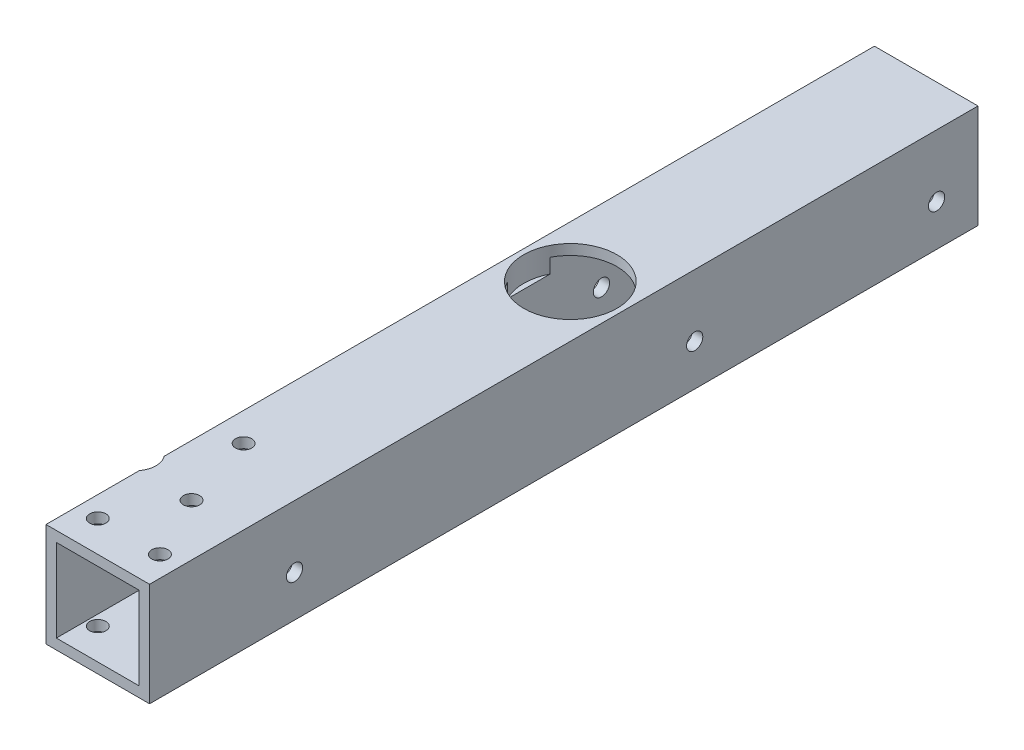
ISO-10303-21;
HEADER;
FILE_DESCRIPTION(('STEP AP214'),'2;1');
FILE_NAME('part.step','',(''),(''),'','','');
FILE_SCHEMA(('AUTOMOTIVE_DESIGN { 1 0 10303 214 1 1 1 1 }'));
ENDSEC;
DATA;
#1=APPLICATION_CONTEXT('core data for automotive mechanical design processes');
#2=APPLICATION_PROTOCOL_DEFINITION('international standard','automotive_design',2000,#1);
#3=PRODUCT_CONTEXT('',#1,'mechanical');
#4=PRODUCT('Part','Part','',(#3));
#5=PRODUCT_RELATED_PRODUCT_CATEGORY('part','',(#4));
#6=PRODUCT_DEFINITION_FORMATION('','',#4);
#7=PRODUCT_DEFINITION_CONTEXT('part definition',#1,'design');
#8=PRODUCT_DEFINITION('design','',#6,#7);
#9=PRODUCT_DEFINITION_SHAPE('','',#8);
#10=(LENGTH_UNIT() NAMED_UNIT(*) SI_UNIT(.MILLI.,.METRE.));
#11=(NAMED_UNIT(*) PLANE_ANGLE_UNIT() SI_UNIT($,.RADIAN.));
#12=(NAMED_UNIT(*) SI_UNIT($,.STERADIAN.) SOLID_ANGLE_UNIT());
#13=UNCERTAINTY_MEASURE_WITH_UNIT(LENGTH_MEASURE(1.E-05),#10,'distance_accuracy_value','');
#14=(GEOMETRIC_REPRESENTATION_CONTEXT(3) GLOBAL_UNCERTAINTY_ASSIGNED_CONTEXT((#13)) GLOBAL_UNIT_ASSIGNED_CONTEXT((#10,
#11,#12)) REPRESENTATION_CONTEXT('',''));
#15=CARTESIAN_POINT('',(0.,0.,0.));
#16=DIRECTION('',(0.,0.,1.));
#17=DIRECTION('',(1.,0.,0.));
#18=AXIS2_PLACEMENT_3D('',#15,#16,#17);
#19=CARTESIAN_POINT('',(-15.875,15.875,127.));
#20=DIRECTION('',(1.,0.,0.));
#21=DIRECTION('',(0.,0.,-1.));
#22=AXIS2_PLACEMENT_3D('',#19,#20,#21);
#23=PLANE('',#22);
#24=CARTESIAN_POINT('',(-15.875,-3.175,-40.132));
#25=DIRECTION('',(1.,0.,0.));
#26=DIRECTION('',(0.,0.,-1.));
#27=AXIS2_PLACEMENT_3D('',#24,#25,#26);
#28=CIRCLE('',#27,2.48919999999999);
#29=CARTESIAN_POINT('',(-15.875,-3.175,-42.6212));
#30=VERTEX_POINT('',#29);
#31=EDGE_CURVE('E242',#30,#30,#28,.T.);
#32=ORIENTED_EDGE('',*,*,#31,.T.);
#33=EDGE_LOOP('',(#32));
#34=FACE_BOUND('',#33,.T.);
#35=CARTESIAN_POINT('',(-15.875,-3.175,-114.3));
#36=DIRECTION('',(1.,0.,0.));
#37=DIRECTION('',(0.,0.,-1.));
#38=AXIS2_PLACEMENT_3D('',#35,#36,#37);
#39=CIRCLE('',#38,2.48919999999999);
#40=CARTESIAN_POINT('',(-15.875,-3.175,-116.7892));
#41=VERTEX_POINT('',#40);
#42=EDGE_CURVE('E247',#41,#41,#39,.T.);
#43=ORIENTED_EDGE('',*,*,#42,.T.);
#44=EDGE_LOOP('',(#43));
#45=FACE_BOUND('',#44,.T.);
#46=CARTESIAN_POINT('',(-15.875,-3.175,82.55));
#47=DIRECTION('',(1.,0.,0.));
#48=DIRECTION('',(0.,0.,-1.));
#49=AXIS2_PLACEMENT_3D('',#46,#47,#48);
#50=CIRCLE('',#49,2.48919999999999);
#51=CARTESIAN_POINT('',(-15.875,-3.175,80.0608));
#52=VERTEX_POINT('',#51);
#53=EDGE_CURVE('E252',#52,#52,#50,.T.);
#54=ORIENTED_EDGE('',*,*,#53,.T.);
#55=EDGE_LOOP('',(#54));
#56=FACE_BOUND('',#55,.T.);
#57=DIRECTION('',(0.,0.,-1.));
#58=VECTOR('',#57,1.);
#59=CARTESIAN_POINT('',(-15.875,-15.875,127.));
#60=LINE('',#59,#58);
#61=CARTESIAN_POINT('',(-15.875,-15.875,90.7476361829292));
#62=VERTEX_POINT('',#61);
#63=CARTESIAN_POINT('',(-15.875,-15.875,-127.));
#64=VERTEX_POINT('',#63);
#65=EDGE_CURVE('E193',#62,#64,#60,.T.);
#66=ORIENTED_EDGE('',*,*,#65,.F.);
#67=DIRECTION('',(0.,1.,0.));
#68=VECTOR('',#67,1.);
#69=CARTESIAN_POINT('',(-15.875,-15.875,90.7476361829292));
#70=LINE('',#69,#68);
#71=CARTESIAN_POINT('',(-15.875,15.875,90.7476361829292));
#72=VERTEX_POINT('',#71);
#73=EDGE_CURVE('E61',#62,#72,#70,.T.);
#74=ORIENTED_EDGE('',*,*,#73,.T.);
#75=DIRECTION('',(0.,0.,-1.));
#76=VECTOR('',#75,1.);
#77=CARTESIAN_POINT('',(-15.875,15.875,127.));
#78=LINE('',#77,#76);
#79=CARTESIAN_POINT('',(-15.875,15.875,-127.));
#80=VERTEX_POINT('',#79);
#81=EDGE_CURVE('E451',#72,#80,#78,.T.);
#82=ORIENTED_EDGE('',*,*,#81,.T.);
#83=DIRECTION('',(0.,-1.,0.));
#84=VECTOR('',#83,1.);
#85=CARTESIAN_POINT('',(-15.875,15.875,-127.));
#86=LINE('',#85,#84);
#87=EDGE_CURVE('E391',#80,#64,#86,.T.);
#88=ORIENTED_EDGE('',*,*,#87,.T.);
#89=EDGE_LOOP('',(#66,#74,#82,#88));
#90=FACE_BOUND('',#89,.T.);
#91=ADVANCED_FACE('F43',(#34,#45,#56,#90),#23,.F.);
#92=CARTESIAN_POINT('',(15.875,-15.875,127.));
#93=DIRECTION('',(-1.,0.,0.));
#94=DIRECTION('',(0.,-1.,0.));
#95=AXIS2_PLACEMENT_3D('',#92,#93,#94);
#96=PLANE('',#95);
#97=CARTESIAN_POINT('',(15.875,-3.175,82.55));
#98=DIRECTION('',(1.,0.,0.));
#99=DIRECTION('',(0.,0.,-1.));
#100=AXIS2_PLACEMENT_3D('',#97,#98,#99);
#101=CIRCLE('',#100,2.48919999999999);
#102=CARTESIAN_POINT('',(15.875,-3.175,80.0608));
#103=VERTEX_POINT('',#102);
#104=EDGE_CURVE('E261',#103,#103,#101,.T.);
#105=ORIENTED_EDGE('',*,*,#104,.F.);
#106=EDGE_LOOP('',(#105));
#107=FACE_BOUND('',#106,.T.);
#108=CARTESIAN_POINT('',(15.875,-3.175,-40.132));
#109=DIRECTION('',(1.,0.,0.));
#110=DIRECTION('',(0.,0.,-1.));
#111=AXIS2_PLACEMENT_3D('',#108,#109,#110);
#112=CIRCLE('',#111,2.48919999999999);
#113=CARTESIAN_POINT('',(15.875,-3.175,-42.6212));
#114=VERTEX_POINT('',#113);
#115=EDGE_CURVE('E279',#114,#114,#112,.T.);
#116=ORIENTED_EDGE('',*,*,#115,.F.);
#117=EDGE_LOOP('',(#116));
#118=FACE_BOUND('',#117,.T.);
#119=DIRECTION('',(0.,0.,-1.));
#120=VECTOR('',#119,1.);
#121=CARTESIAN_POINT('',(15.875,-15.875,127.));
#122=LINE('',#121,#120);
#123=CARTESIAN_POINT('',(15.875,-15.875,127.));
#124=VERTEX_POINT('',#123);
#125=CARTESIAN_POINT('',(15.875,-15.875,-127.));
#126=VERTEX_POINT('',#125);
#127=EDGE_CURVE('E199',#124,#126,#122,.T.);
#128=ORIENTED_EDGE('',*,*,#127,.T.);
#129=DIRECTION('',(0.,1.,0.));
#130=VECTOR('',#129,1.);
#131=CARTESIAN_POINT('',(15.875,-15.875,-127.));
#132=LINE('',#131,#130);
#133=CARTESIAN_POINT('',(15.875,15.875,-127.));
#134=VERTEX_POINT('',#133);
#135=EDGE_CURVE('E399',#126,#134,#132,.T.);
#136=ORIENTED_EDGE('',*,*,#135,.T.);
#137=DIRECTION('',(0.,0.,-1.));
#138=VECTOR('',#137,1.);
#139=CARTESIAN_POINT('',(15.875,15.875,127.));
#140=LINE('',#139,#138);
#141=CARTESIAN_POINT('',(15.875,15.875,127.));
#142=VERTEX_POINT('',#141);
#143=EDGE_CURVE('E453',#142,#134,#140,.T.);
#144=ORIENTED_EDGE('',*,*,#143,.F.);
#145=DIRECTION('',(0.,1.,0.));
#146=VECTOR('',#145,1.);
#147=CARTESIAN_POINT('',(15.875,-15.875,127.));
#148=LINE('',#147,#146);
#149=EDGE_CURVE('E445',#124,#142,#148,.T.);
#150=ORIENTED_EDGE('',*,*,#149,.F.);
#151=EDGE_LOOP('',(#128,#136,#144,#150));
#152=FACE_BOUND('',#151,.T.);
#153=CARTESIAN_POINT('',(15.875,-3.175,-114.3));
#154=DIRECTION('',(1.,0.,0.));
#155=DIRECTION('',(0.,0.,-1.));
#156=AXIS2_PLACEMENT_3D('',#153,#154,#155);
#157=CIRCLE('',#156,2.48919999999999);
#158=CARTESIAN_POINT('',(15.875,-3.175,-116.7892));
#159=VERTEX_POINT('',#158);
#160=EDGE_CURVE('E258',#159,#159,#157,.T.);
#161=ORIENTED_EDGE('',*,*,#160,.F.);
#162=EDGE_LOOP('',(#161));
#163=FACE_BOUND('',#162,.T.);
#164=ADVANCED_FACE('F462',(#107,#118,#152,#163),#96,.F.);
#165=CARTESIAN_POINT('',(-12.7,-12.7,127.));
#166=DIRECTION('',(0.,1.,0.));
#167=DIRECTION('',(0.,0.,1.));
#168=AXIS2_PLACEMENT_3D('',#165,#166,#167);
#169=PLANE('',#168);
#170=CARTESIAN_POINT('',(0.,-12.7,-35.9156));
#171=DIRECTION('',(0.,1.,0.));
#172=DIRECTION('',(0.,0.,1.));
#173=AXIS2_PLACEMENT_3D('',#170,#171,#172);
#174=CIRCLE('',#173,1.7272);
#175=CARTESIAN_POINT('',(0.,-12.7,-34.1884));
#176=VERTEX_POINT('',#175);
#177=EDGE_CURVE('E624',#176,#176,#174,.T.);
#178=ORIENTED_EDGE('',*,*,#177,.F.);
#179=EDGE_LOOP('',(#178));
#180=FACE_BOUND('',#179,.T.);
#181=CARTESIAN_POINT('',(0.,-12.7,-17.8816));
#182=DIRECTION('',(0.,1.,0.));
#183=DIRECTION('',(0.,0.,1.));
#184=AXIS2_PLACEMENT_3D('',#181,#182,#183);
#185=CIRCLE('',#184,14.2875);
#186=CARTESIAN_POINT('',(12.7,-12.7,-24.427030180668));
#187=VERTEX_POINT('',#186);
#188=CARTESIAN_POINT('',(-12.7,-12.7,-24.427030180668));
#189=VERTEX_POINT('',#188);
#190=EDGE_CURVE('E304',#187,#189,#185,.T.);
#191=ORIENTED_EDGE('',*,*,#190,.F.);
#192=DIRECTION('',(0.,0.,-1.));
#193=VECTOR('',#192,1.);
#194=CARTESIAN_POINT('',(12.7,-12.7,127.));
#195=LINE('',#194,#193);
#196=CARTESIAN_POINT('',(12.7,-12.7,-127.));
#197=VERTEX_POINT('',#196);
#198=EDGE_CURVE('E430',#187,#197,#195,.T.);
#199=ORIENTED_EDGE('',*,*,#198,.T.);
#200=DIRECTION('',(1.,0.,0.));
#201=VECTOR('',#200,1.);
#202=CARTESIAN_POINT('',(-12.7,-12.7,-127.));
#203=LINE('',#202,#201);
#204=CARTESIAN_POINT('',(-12.7,-12.7,-127.));
#205=VERTEX_POINT('',#204);
#206=EDGE_CURVE('E379',#205,#197,#203,.T.);
#207=ORIENTED_EDGE('',*,*,#206,.F.);
#208=DIRECTION('',(0.,0.,-1.));
#209=VECTOR('',#208,1.);
#210=CARTESIAN_POINT('',(-12.7,-12.7,127.));
#211=LINE('',#210,#209);
#212=EDGE_CURVE('E435',#189,#205,#211,.T.);
#213=ORIENTED_EDGE('',*,*,#212,.F.);
#214=EDGE_LOOP('',(#191,#199,#207,#213));
#215=FACE_BOUND('',#214,.T.);
#216=ADVANCED_FACE('F543',(#180,#215),#169,.T.);
#217=CARTESIAN_POINT('',(12.7,12.7,127.));
#218=DIRECTION('',(0.,-1.,0.));
#219=DIRECTION('',(0.,0.,-1.));
#220=AXIS2_PLACEMENT_3D('',#217,#218,#219);
#221=PLANE('',#220);
#222=CARTESIAN_POINT('',(0.,12.7,-17.8816));
#223=DIRECTION('',(0.,-1.,0.));
#224=DIRECTION('',(0.,0.,-1.));
#225=AXIS2_PLACEMENT_3D('',#222,#223,#224);
#226=CIRCLE('',#225,14.2875);
#227=CARTESIAN_POINT('',(12.7,12.7,-11.336169819332));
#228=VERTEX_POINT('',#227);
#229=CARTESIAN_POINT('',(-12.7,12.7,-11.336169819332));
#230=VERTEX_POINT('',#229);
#231=EDGE_CURVE('E197',#228,#230,#226,.T.);
#232=ORIENTED_EDGE('',*,*,#231,.F.);
#233=DIRECTION('',(0.,0.,-1.));
#234=VECTOR('',#233,1.);
#235=CARTESIAN_POINT('',(12.7,12.7,127.));
#236=LINE('',#235,#234);
#237=CARTESIAN_POINT('',(12.7,12.7,127.));
#238=VERTEX_POINT('',#237);
#239=EDGE_CURVE('E426',#238,#228,#236,.T.);
#240=ORIENTED_EDGE('',*,*,#239,.F.);
#241=DIRECTION('',(-1.,0.,0.));
#242=VECTOR('',#241,1.);
#243=CARTESIAN_POINT('',(12.7,12.7,127.));
#244=LINE('',#243,#242);
#245=CARTESIAN_POINT('',(-12.7,12.7,127.));
#246=VERTEX_POINT('',#245);
#247=EDGE_CURVE('E417',#238,#246,#244,.T.);
#248=ORIENTED_EDGE('',*,*,#247,.T.);
#249=DIRECTION('',(0.,0.,-1.));
#250=VECTOR('',#249,1.);
#251=CARTESIAN_POINT('',(-12.7,12.7,127.));
#252=LINE('',#251,#250);
#253=EDGE_CURVE('E421',#246,#230,#252,.T.);
#254=ORIENTED_EDGE('',*,*,#253,.T.);
#255=EDGE_LOOP('',(#232,#240,#248,#254));
#256=FACE_BOUND('',#255,.T.);
#257=CARTESIAN_POINT('',(-9.525,12.7,117.475));
#258=DIRECTION('',(0.,-1.,0.));
#259=DIRECTION('',(0.,0.,-1.));
#260=AXIS2_PLACEMENT_3D('',#257,#258,#259);
#261=CIRCLE('',#260,2.48919999999999);
#262=CARTESIAN_POINT('',(-9.525,12.7,114.9858));
#263=VERTEX_POINT('',#262);
#264=EDGE_CURVE('E221',#263,#263,#261,.T.);
#265=ORIENTED_EDGE('',*,*,#264,.F.);
#266=EDGE_LOOP('',(#265));
#267=FACE_BOUND('',#266,.T.);
#268=CARTESIAN_POINT('',(9.525,12.7,117.475));
#269=DIRECTION('',(0.,-1.,0.));
#270=DIRECTION('',(0.,0.,-1.));
#271=AXIS2_PLACEMENT_3D('',#268,#269,#270);
#272=CIRCLE('',#271,2.48919999999999);
#273=CARTESIAN_POINT('',(9.525,12.7,114.9858));
#274=VERTEX_POINT('',#273);
#275=EDGE_CURVE('E215',#274,#274,#272,.T.);
#276=ORIENTED_EDGE('',*,*,#275,.F.);
#277=EDGE_LOOP('',(#276));
#278=FACE_BOUND('',#277,.T.);
#279=CARTESIAN_POINT('',(0.,12.7,98.2472000005383));
#280=DIRECTION('',(0.,-1.,0.));
#281=DIRECTION('',(0.,0.,-1.));
#282=AXIS2_PLACEMENT_3D('',#279,#280,#281);
#283=CIRCLE('',#282,2.48919999999999);
#284=CARTESIAN_POINT('',(0.,12.7,95.7580000005383));
#285=VERTEX_POINT('',#284);
#286=EDGE_CURVE('E213',#285,#285,#283,.T.);
#287=ORIENTED_EDGE('',*,*,#286,.F.);
#288=EDGE_LOOP('',(#287));
#289=FACE_BOUND('',#288,.T.);
#290=CARTESIAN_POINT('',(-7.11193905207069,12.7,75.1712567047931));
#291=DIRECTION('',(0.,-1.,0.));
#292=DIRECTION('',(0.,0.,-1.));
#293=AXIS2_PLACEMENT_3D('',#290,#291,#292);
#294=CIRCLE('',#293,2.48919999999999);
#295=CARTESIAN_POINT('',(-7.11193905207069,12.7,72.6820567047931));
#296=VERTEX_POINT('',#295);
#297=EDGE_CURVE('E207',#296,#296,#294,.T.);
#298=ORIENTED_EDGE('',*,*,#297,.F.);
#299=EDGE_LOOP('',(#298));
#300=FACE_BOUND('',#299,.T.);
#301=ADVANCED_FACE('F513',(#256,#267,#278,#289,#300),#221,.T.);
#302=CARTESIAN_POINT('',(15.875,15.875,127.));
#303=DIRECTION('',(0.,-1.,0.));
#304=DIRECTION('',(0.,0.,-1.));
#305=AXIS2_PLACEMENT_3D('',#302,#303,#304);
#306=PLANE('',#305);
#307=CARTESIAN_POINT('',(0.,15.875,-17.8816));
#308=DIRECTION('',(0.,1.,0.));
#309=DIRECTION('',(0.,0.,1.));
#310=AXIS2_PLACEMENT_3D('',#307,#308,#309);
#311=CIRCLE('',#310,14.2875);
#312=CARTESIAN_POINT('',(0.,15.875,-3.59409999999999));
#313=VERTEX_POINT('',#312);
#314=EDGE_CURVE('E310',#313,#313,#311,.T.);
#315=ORIENTED_EDGE('',*,*,#314,.F.);
#316=EDGE_LOOP('',(#315));
#317=FACE_BOUND('',#316,.T.);
#318=CARTESIAN_POINT('',(-9.525,15.875,117.475));
#319=DIRECTION('',(0.,1.,0.));
#320=DIRECTION('',(0.,0.,1.));
#321=AXIS2_PLACEMENT_3D('',#318,#319,#320);
#322=CIRCLE('',#321,2.48919999999999);
#323=CARTESIAN_POINT('',(-9.525,15.875,119.9642));
#324=VERTEX_POINT('',#323);
#325=EDGE_CURVE('E335',#324,#324,#322,.T.);
#326=ORIENTED_EDGE('',*,*,#325,.F.);
#327=EDGE_LOOP('',(#326));
#328=FACE_BOUND('',#327,.T.);
#329=CARTESIAN_POINT('',(9.525,15.875,117.475));
#330=DIRECTION('',(0.,1.,0.));
#331=DIRECTION('',(0.,0.,1.));
#332=AXIS2_PLACEMENT_3D('',#329,#330,#331);
#333=CIRCLE('',#332,2.48919999999999);
#334=CARTESIAN_POINT('',(9.525,15.875,119.9642));
#335=VERTEX_POINT('',#334);
#336=EDGE_CURVE('E345',#335,#335,#333,.T.);
#337=ORIENTED_EDGE('',*,*,#336,.F.);
#338=EDGE_LOOP('',(#337));
#339=FACE_BOUND('',#338,.T.);
#340=CARTESIAN_POINT('',(-7.11193905207069,15.875,75.1712567047931));
#341=DIRECTION('',(0.,1.,0.));
#342=DIRECTION('',(0.,0.,1.));
#343=AXIS2_PLACEMENT_3D('',#340,#341,#342);
#344=CIRCLE('',#343,2.48919999999999);
#345=CARTESIAN_POINT('',(-7.11193905207069,15.875,77.6604567047931));
#346=VERTEX_POINT('',#345);
#347=EDGE_CURVE('E365',#346,#346,#344,.T.);
#348=ORIENTED_EDGE('',*,*,#347,.F.);
#349=EDGE_LOOP('',(#348));
#350=FACE_BOUND('',#349,.T.);
#351=ORIENTED_EDGE('',*,*,#81,.F.);
#352=CARTESIAN_POINT('',(-20.955,15.875,94.5576361829292));
#353=DIRECTION('',(0.,1.,0.));
#354=DIRECTION('',(0.,0.,1.));
#355=AXIS2_PLACEMENT_3D('',#352,#353,#354);
#356=CIRCLE('',#355,6.35);
#357=CARTESIAN_POINT('',(-15.875,15.875,98.3676361829292));
#358=VERTEX_POINT('',#357);
#359=EDGE_CURVE('E176',#358,#72,#356,.T.);
#360=ORIENTED_EDGE('',*,*,#359,.F.);
#361=CARTESIAN_POINT('',(-15.875,15.875,127.));
#362=VERTEX_POINT('',#361);
#363=EDGE_CURVE('E184',#362,#358,#78,.T.);
#364=ORIENTED_EDGE('',*,*,#363,.F.);
#365=DIRECTION('',(-1.,0.,0.));
#366=VECTOR('',#365,1.);
#367=CARTESIAN_POINT('',(15.875,15.875,127.));
#368=LINE('',#367,#366);
#369=EDGE_CURVE('E448',#142,#362,#368,.T.);
#370=ORIENTED_EDGE('',*,*,#369,.F.);
#371=ORIENTED_EDGE('',*,*,#143,.T.);
#372=DIRECTION('',(-1.,0.,0.));
#373=VECTOR('',#372,1.);
#374=CARTESIAN_POINT('',(15.875,15.875,-127.));
#375=LINE('',#374,#373);
#376=EDGE_CURVE('E403',#134,#80,#375,.T.);
#377=ORIENTED_EDGE('',*,*,#376,.T.);
#378=EDGE_LOOP('',(#351,#360,#364,#370,#371,#377));
#379=FACE_BOUND('',#378,.T.);
#380=CARTESIAN_POINT('',(0.,15.875,98.2472000005383));
#381=DIRECTION('',(0.,1.,0.));
#382=DIRECTION('',(0.,0.,1.));
#383=AXIS2_PLACEMENT_3D('',#380,#381,#382);
#384=CIRCLE('',#383,2.48919999999999);
#385=CARTESIAN_POINT('',(0.,15.875,100.736400000538));
#386=VERTEX_POINT('',#385);
#387=EDGE_CURVE('E355',#386,#386,#384,.T.);
#388=ORIENTED_EDGE('',*,*,#387,.F.);
#389=EDGE_LOOP('',(#388));
#390=FACE_BOUND('',#389,.T.);
#391=ADVANCED_FACE('F471',(#317,#328,#339,#350,#379,#390),#306,.F.);
#392=CARTESIAN_POINT('',(0.,0.,127.));
#393=DIRECTION('',(0.,0.,1.));
#394=DIRECTION('',(1.,0.,0.));
#395=AXIS2_PLACEMENT_3D('',#392,#393,#394);
#396=PLANE('',#395);
#397=DIRECTION('',(0.,-1.,0.));
#398=VECTOR('',#397,1.);
#399=CARTESIAN_POINT('',(-15.875,15.875,127.));
#400=LINE('',#399,#398);
#401=CARTESIAN_POINT('',(-15.875,-15.875,127.));
#402=VERTEX_POINT('',#401);
#403=EDGE_CURVE('E440',#362,#402,#400,.T.);
#404=ORIENTED_EDGE('',*,*,#403,.T.);
#405=DIRECTION('',(1.,0.,0.));
#406=VECTOR('',#405,1.);
#407=CARTESIAN_POINT('',(-15.875,-15.875,127.));
#408=LINE('',#407,#406);
#409=EDGE_CURVE('E189',#402,#124,#408,.T.);
#410=ORIENTED_EDGE('',*,*,#409,.T.);
#411=ORIENTED_EDGE('',*,*,#149,.T.);
#412=ORIENTED_EDGE('',*,*,#369,.T.);
#413=EDGE_LOOP('',(#404,#410,#411,#412));
#414=FACE_BOUND('',#413,.T.);
#415=DIRECTION('',(1.,0.,0.));
#416=VECTOR('',#415,1.);
#417=CARTESIAN_POINT('',(-12.7,-12.7,127.));
#418=LINE('',#417,#416);
#419=CARTESIAN_POINT('',(-12.7,-12.7,127.));
#420=VERTEX_POINT('',#419);
#421=CARTESIAN_POINT('',(12.7,-12.7,127.));
#422=VERTEX_POINT('',#421);
#423=EDGE_CURVE('E410',#420,#422,#418,.T.);
#424=ORIENTED_EDGE('',*,*,#423,.F.);
#425=DIRECTION('',(0.,-1.,0.));
#426=VECTOR('',#425,1.);
#427=CARTESIAN_POINT('',(-12.7,12.7,127.));
#428=LINE('',#427,#426);
#429=EDGE_CURVE('E407',#246,#420,#428,.T.);
#430=ORIENTED_EDGE('',*,*,#429,.F.);
#431=ORIENTED_EDGE('',*,*,#247,.F.);
#432=DIRECTION('',(0.,1.,0.));
#433=VECTOR('',#432,1.);
#434=CARTESIAN_POINT('',(12.7,-12.7,127.));
#435=LINE('',#434,#433);
#436=EDGE_CURVE('E413',#422,#238,#435,.T.);
#437=ORIENTED_EDGE('',*,*,#436,.F.);
#438=EDGE_LOOP('',(#424,#430,#431,#437));
#439=FACE_BOUND('',#438,.T.);
#440=ADVANCED_FACE('F508',(#414,#439),#396,.T.);
#441=ORIENTED_EDGE('',*,*,#363,.T.);
#442=DIRECTION('',(0.,1.,0.));
#443=VECTOR('',#442,1.);
#444=CARTESIAN_POINT('',(-15.875,-15.875,98.3676361829292));
#445=LINE('',#444,#443);
#446=CARTESIAN_POINT('',(-15.875,-15.875,98.3676361829292));
#447=VERTEX_POINT('',#446);
#448=EDGE_CURVE('E170',#358,#447,#445,.F.);
#449=ORIENTED_EDGE('',*,*,#448,.T.);
#450=EDGE_CURVE('E182',#402,#447,#60,.T.);
#451=ORIENTED_EDGE('',*,*,#450,.F.);
#452=ORIENTED_EDGE('',*,*,#403,.F.);
#453=EDGE_LOOP('',(#441,#449,#451,#452));
#454=FACE_BOUND('',#453,.T.);
#455=ADVANCED_FACE('F45',(#454),#23,.F.);
#456=CARTESIAN_POINT('',(-15.875,-15.875,127.));
#457=DIRECTION('',(0.,1.,0.));
#458=DIRECTION('',(0.,0.,1.));
#459=AXIS2_PLACEMENT_3D('',#456,#457,#458);
#460=PLANE('',#459);
#461=CARTESIAN_POINT('',(0.,-15.875,-35.9156));
#462=DIRECTION('',(0.,-1.,0.));
#463=DIRECTION('',(0.,0.,-1.));
#464=AXIS2_PLACEMENT_3D('',#461,#462,#463);
#465=CIRCLE('',#464,1.7272);
#466=CARTESIAN_POINT('',(0.,-15.875,-37.6428));
#467=VERTEX_POINT('',#466);
#468=EDGE_CURVE('E821',#467,#467,#465,.T.);
#469=ORIENTED_EDGE('',*,*,#468,.F.);
#470=EDGE_LOOP('',(#469));
#471=FACE_BOUND('',#470,.T.);
#472=CARTESIAN_POINT('',(0.,-15.875,0.152399999999976));
#473=DIRECTION('',(0.,-1.,0.));
#474=DIRECTION('',(0.,0.,-1.));
#475=AXIS2_PLACEMENT_3D('',#472,#473,#474);
#476=CIRCLE('',#475,1.7272);
#477=CARTESIAN_POINT('',(0.,-15.875,-1.57480000000002));
#478=VERTEX_POINT('',#477);
#479=EDGE_CURVE('E825',#478,#478,#476,.T.);
#480=ORIENTED_EDGE('',*,*,#479,.F.);
#481=EDGE_LOOP('',(#480));
#482=FACE_BOUND('',#481,.T.);
#483=CARTESIAN_POINT('',(0.,-15.875,-17.8816));
#484=DIRECTION('',(0.,-1.,0.));
#485=DIRECTION('',(0.,0.,-1.));
#486=AXIS2_PLACEMENT_3D('',#483,#484,#485);
#487=CIRCLE('',#486,14.2875);
#488=CARTESIAN_POINT('',(0.,-15.875,-32.1691));
#489=VERTEX_POINT('',#488);
#490=EDGE_CURVE('E289',#489,#489,#487,.T.);
#491=ORIENTED_EDGE('',*,*,#490,.F.);
#492=EDGE_LOOP('',(#491));
#493=FACE_BOUND('',#492,.T.);
#494=CARTESIAN_POINT('',(-9.525,-15.875,117.475));
#495=DIRECTION('',(0.,1.,0.));
#496=DIRECTION('',(0.,0.,1.));
#497=AXIS2_PLACEMENT_3D('',#494,#495,#496);
#498=CIRCLE('',#497,2.48919999999999);
#499=CARTESIAN_POINT('',(-9.525,-15.875,119.9642));
#500=VERTEX_POINT('',#499);
#501=EDGE_CURVE('E225',#500,#500,#498,.T.);
#502=ORIENTED_EDGE('',*,*,#501,.T.);
#503=EDGE_LOOP('',(#502));
#504=FACE_BOUND('',#503,.T.);
#505=CARTESIAN_POINT('',(9.525,-15.875,117.475));
#506=DIRECTION('',(0.,1.,0.));
#507=DIRECTION('',(0.,0.,1.));
#508=AXIS2_PLACEMENT_3D('',#505,#506,#507);
#509=CIRCLE('',#508,2.48919999999999);
#510=CARTESIAN_POINT('',(9.525,-15.875,119.9642));
#511=VERTEX_POINT('',#510);
#512=EDGE_CURVE('E220',#511,#511,#509,.T.);
#513=ORIENTED_EDGE('',*,*,#512,.T.);
#514=EDGE_LOOP('',(#513));
#515=FACE_BOUND('',#514,.T.);
#516=CARTESIAN_POINT('',(0.,-15.875,98.2472000005383));
#517=DIRECTION('',(0.,1.,0.));
#518=DIRECTION('',(0.,0.,1.));
#519=AXIS2_PLACEMENT_3D('',#516,#517,#518);
#520=CIRCLE('',#519,2.48919999999999);
#521=CARTESIAN_POINT('',(0.,-15.875,100.736400000538));
#522=VERTEX_POINT('',#521);
#523=EDGE_CURVE('E214',#522,#522,#520,.T.);
#524=ORIENTED_EDGE('',*,*,#523,.T.);
#525=EDGE_LOOP('',(#524));
#526=FACE_BOUND('',#525,.T.);
#527=CARTESIAN_POINT('',(-7.11193905207069,-15.875,75.1712567047931));
#528=DIRECTION('',(0.,1.,0.));
#529=DIRECTION('',(0.,0.,1.));
#530=AXIS2_PLACEMENT_3D('',#527,#528,#529);
#531=CIRCLE('',#530,2.48919999999999);
#532=CARTESIAN_POINT('',(-7.11193905207069,-15.875,77.6604567047931));
#533=VERTEX_POINT('',#532);
#534=EDGE_CURVE('E208',#533,#533,#531,.T.);
#535=ORIENTED_EDGE('',*,*,#534,.T.);
#536=EDGE_LOOP('',(#535));
#537=FACE_BOUND('',#536,.T.);
#538=ORIENTED_EDGE('',*,*,#450,.T.);
#539=CARTESIAN_POINT('',(-20.955,-15.875,94.5576361829292));
#540=DIRECTION('',(0.,1.,0.));
#541=DIRECTION('',(0.,0.,1.));
#542=AXIS2_PLACEMENT_3D('',#539,#540,#541);
#543=CIRCLE('',#542,6.35);
#544=EDGE_CURVE('E167',#447,#62,#543,.T.);
#545=ORIENTED_EDGE('',*,*,#544,.T.);
#546=ORIENTED_EDGE('',*,*,#65,.T.);
#547=DIRECTION('',(1.,0.,0.));
#548=VECTOR('',#547,1.);
#549=CARTESIAN_POINT('',(-15.875,-15.875,-127.));
#550=LINE('',#549,#548);
#551=EDGE_CURVE('E395',#64,#126,#550,.T.);
#552=ORIENTED_EDGE('',*,*,#551,.T.);
#553=ORIENTED_EDGE('',*,*,#127,.F.);
#554=ORIENTED_EDGE('',*,*,#409,.F.);
#555=EDGE_LOOP('',(#538,#545,#546,#552,#553,#554));
#556=FACE_BOUND('',#555,.T.);
#557=ADVANCED_FACE('F187',(#471,#482,#493,#504,#515,#526,#537,#556),#460,.F.);
#558=CARTESIAN_POINT('',(-12.7,12.7,127.));
#559=DIRECTION('',(1.,0.,0.));
#560=DIRECTION('',(0.,1.,0.));
#561=AXIS2_PLACEMENT_3D('',#558,#559,#560);
#562=PLANE('',#561);
#563=CARTESIAN_POINT('',(-12.7,-3.175,82.55));
#564=DIRECTION('',(1.,0.,0.));
#565=DIRECTION('',(0.,1.,0.));
#566=AXIS2_PLACEMENT_3D('',#563,#564,#565);
#567=CIRCLE('',#566,2.48919999999999);
#568=CARTESIAN_POINT('',(-12.7,-0.68580000000001,82.55));
#569=VERTEX_POINT('',#568);
#570=EDGE_CURVE('E251',#569,#569,#567,.T.);
#571=ORIENTED_EDGE('',*,*,#570,.F.);
#572=EDGE_LOOP('',(#571));
#573=FACE_BOUND('',#572,.T.);
#574=CARTESIAN_POINT('',(-12.7,-3.175,-114.3));
#575=DIRECTION('',(1.,0.,0.));
#576=DIRECTION('',(0.,1.,0.));
#577=AXIS2_PLACEMENT_3D('',#574,#575,#576);
#578=CIRCLE('',#577,2.48919999999999);
#579=CARTESIAN_POINT('',(-12.7,-0.68580000000001,-114.3));
#580=VERTEX_POINT('',#579);
#581=EDGE_CURVE('E246',#580,#580,#578,.T.);
#582=ORIENTED_EDGE('',*,*,#581,.F.);
#583=EDGE_LOOP('',(#582));
#584=FACE_BOUND('',#583,.T.);
#585=CARTESIAN_POINT('',(-12.7,-3.175,-40.132));
#586=DIRECTION('',(1.,0.,0.));
#587=DIRECTION('',(0.,1.,0.));
#588=AXIS2_PLACEMENT_3D('',#585,#586,#587);
#589=CIRCLE('',#588,2.48919999999999);
#590=CARTESIAN_POINT('',(-12.7,-0.68580000000001,-40.132));
#591=VERTEX_POINT('',#590);
#592=EDGE_CURVE('E237',#591,#591,#589,.T.);
#593=ORIENTED_EDGE('',*,*,#592,.F.);
#594=EDGE_LOOP('',(#593));
#595=FACE_BOUND('',#594,.T.);
#596=DIRECTION('',(0.,-1.,0.));
#597=VECTOR('',#596,1.);
#598=CARTESIAN_POINT('',(-12.7,-8.255,-11.336169819332));
#599=LINE('',#598,#597);
#600=CARTESIAN_POINT('',(-12.7,-8.255,-11.336169819332));
#601=VERTEX_POINT('',#600);
#602=CARTESIAN_POINT('',(-12.7,-12.7,-11.336169819332));
#603=VERTEX_POINT('',#602);
#604=EDGE_CURVE('E303',#601,#603,#599,.T.);
#605=ORIENTED_EDGE('',*,*,#604,.F.);
#606=DIRECTION('',(0.,0.,-1.));
#607=VECTOR('',#606,1.);
#608=CARTESIAN_POINT('',(-12.7,-8.255,127.));
#609=LINE('',#608,#607);
#610=CARTESIAN_POINT('',(-12.7,-8.255,-24.427030180668));
#611=VERTEX_POINT('',#610);
#612=EDGE_CURVE('E292',#601,#611,#609,.T.);
#613=ORIENTED_EDGE('',*,*,#612,.T.);
#614=DIRECTION('',(0.,-1.,0.));
#615=VECTOR('',#614,1.);
#616=CARTESIAN_POINT('',(-12.7,-8.255,-24.427030180668));
#617=LINE('',#616,#615);
#618=EDGE_CURVE('E307',#189,#611,#617,.F.);
#619=ORIENTED_EDGE('',*,*,#618,.F.);
#620=ORIENTED_EDGE('',*,*,#212,.T.);
#621=DIRECTION('',(0.,-1.,0.));
#622=VECTOR('',#621,1.);
#623=CARTESIAN_POINT('',(-12.7,12.7,-127.));
#624=LINE('',#623,#622);
#625=CARTESIAN_POINT('',(-12.7,12.7,-127.));
#626=VERTEX_POINT('',#625);
#627=EDGE_CURVE('E375',#626,#205,#624,.T.);
#628=ORIENTED_EDGE('',*,*,#627,.F.);
#629=CARTESIAN_POINT('',(-12.7,12.7,-24.427030180668));
#630=VERTEX_POINT('',#629);
#631=EDGE_CURVE('E420',#630,#626,#252,.T.);
#632=ORIENTED_EDGE('',*,*,#631,.F.);
#633=DIRECTION('',(0.,1.,0.));
#634=VECTOR('',#633,1.);
#635=CARTESIAN_POINT('',(-12.7,8.255,-24.427030180668));
#636=LINE('',#635,#634);
#637=CARTESIAN_POINT('',(-12.7,8.255,-24.427030180668));
#638=VERTEX_POINT('',#637);
#639=EDGE_CURVE('E322',#638,#630,#636,.T.);
#640=ORIENTED_EDGE('',*,*,#639,.F.);
#641=DIRECTION('',(0.,0.,1.));
#642=VECTOR('',#641,1.);
#643=CARTESIAN_POINT('',(-12.7,8.255,127.));
#644=LINE('',#643,#642);
#645=CARTESIAN_POINT('',(-12.7,8.255,-11.336169819332));
#646=VERTEX_POINT('',#645);
#647=EDGE_CURVE('E331',#638,#646,#644,.T.);
#648=ORIENTED_EDGE('',*,*,#647,.T.);
#649=DIRECTION('',(0.,1.,0.));
#650=VECTOR('',#649,1.);
#651=CARTESIAN_POINT('',(-12.7,8.255,-11.336169819332));
#652=LINE('',#651,#650);
#653=EDGE_CURVE('E328',#230,#646,#652,.F.);
#654=ORIENTED_EDGE('',*,*,#653,.F.);
#655=ORIENTED_EDGE('',*,*,#253,.F.);
#656=ORIENTED_EDGE('',*,*,#429,.T.);
#657=EDGE_CURVE('E436',#420,#603,#211,.T.);
#658=ORIENTED_EDGE('',*,*,#657,.T.);
#659=EDGE_LOOP('',(#605,#613,#619,#620,#628,#632,#640,#648,#654,#655,#656,#658));
#660=FACE_BOUND('',#659,.T.);
#661=ADVANCED_FACE('F490',(#573,#584,#595,#660),#562,.T.);
#662=CARTESIAN_POINT('',(0.,-12.7,0.152399999999976));
#663=DIRECTION('',(0.,1.,0.));
#664=DIRECTION('',(0.,0.,1.));
#665=AXIS2_PLACEMENT_3D('',#662,#663,#664);
#666=CIRCLE('',#665,1.7272);
#667=CARTESIAN_POINT('',(0.,-12.7,1.87959999999998));
#668=VERTEX_POINT('',#667);
#669=EDGE_CURVE('E47',#668,#668,#666,.T.);
#670=ORIENTED_EDGE('',*,*,#669,.F.);
#671=EDGE_LOOP('',(#670));
#672=FACE_BOUND('',#671,.T.);
#673=CARTESIAN_POINT('',(12.7,-12.7,-11.336169819332));
#674=VERTEX_POINT('',#673);
#675=EDGE_CURVE('E300',#603,#674,#185,.T.);
#676=ORIENTED_EDGE('',*,*,#675,.F.);
#677=ORIENTED_EDGE('',*,*,#657,.F.);
#678=ORIENTED_EDGE('',*,*,#423,.T.);
#679=EDGE_CURVE('E431',#422,#674,#195,.T.);
#680=ORIENTED_EDGE('',*,*,#679,.T.);
#681=EDGE_LOOP('',(#676,#677,#678,#680));
#682=FACE_BOUND('',#681,.T.);
#683=CARTESIAN_POINT('',(-9.525,-12.7,117.475));
#684=DIRECTION('',(0.,1.,0.));
#685=DIRECTION('',(0.,0.,1.));
#686=AXIS2_PLACEMENT_3D('',#683,#684,#685);
#687=CIRCLE('',#686,2.48919999999999);
#688=CARTESIAN_POINT('',(-9.525,-12.7,119.9642));
#689=VERTEX_POINT('',#688);
#690=EDGE_CURVE('E224',#689,#689,#687,.T.);
#691=ORIENTED_EDGE('',*,*,#690,.F.);
#692=EDGE_LOOP('',(#691));
#693=FACE_BOUND('',#692,.T.);
#694=CARTESIAN_POINT('',(9.525,-12.7,117.475));
#695=DIRECTION('',(0.,1.,0.));
#696=DIRECTION('',(0.,0.,1.));
#697=AXIS2_PLACEMENT_3D('',#694,#695,#696);
#698=CIRCLE('',#697,2.48919999999999);
#699=CARTESIAN_POINT('',(9.525,-12.7,119.9642));
#700=VERTEX_POINT('',#699);
#701=EDGE_CURVE('E219',#700,#700,#698,.T.);
#702=ORIENTED_EDGE('',*,*,#701,.F.);
#703=EDGE_LOOP('',(#702));
#704=FACE_BOUND('',#703,.T.);
#705=CARTESIAN_POINT('',(0.,-12.7,98.2472000005383));
#706=DIRECTION('',(0.,1.,0.));
#707=DIRECTION('',(0.,0.,1.));
#708=AXIS2_PLACEMENT_3D('',#705,#706,#707);
#709=CIRCLE('',#708,2.48919999999999);
#710=CARTESIAN_POINT('',(0.,-12.7,100.736400000538));
#711=VERTEX_POINT('',#710);
#712=EDGE_CURVE('E209',#711,#711,#709,.T.);
#713=ORIENTED_EDGE('',*,*,#712,.F.);
#714=EDGE_LOOP('',(#713));
#715=FACE_BOUND('',#714,.T.);
#716=CARTESIAN_POINT('',(-7.11193905207069,-12.7,75.1712567047931));
#717=DIRECTION('',(0.,1.,0.));
#718=DIRECTION('',(0.,0.,1.));
#719=AXIS2_PLACEMENT_3D('',#716,#717,#718);
#720=CIRCLE('',#719,2.48919999999999);
#721=CARTESIAN_POINT('',(-7.11193905207069,-12.7,77.6604567047931));
#722=VERTEX_POINT('',#721);
#723=EDGE_CURVE('E203',#722,#722,#720,.T.);
#724=ORIENTED_EDGE('',*,*,#723,.F.);
#725=EDGE_LOOP('',(#724));
#726=FACE_BOUND('',#725,.T.);
#727=ADVANCED_FACE('F498',(#672,#682,#693,#704,#715,#726),#169,.T.);
#728=CARTESIAN_POINT('',(12.7,-12.7,127.));
#729=DIRECTION('',(-1.,0.,0.));
#730=DIRECTION('',(0.,-1.,0.));
#731=AXIS2_PLACEMENT_3D('',#728,#729,#730);
#732=PLANE('',#731);
#733=CARTESIAN_POINT('',(12.7,-3.175,82.55));
#734=DIRECTION('',(-1.,0.,0.));
#735=DIRECTION('',(0.,-1.,0.));
#736=AXIS2_PLACEMENT_3D('',#733,#734,#735);
#737=CIRCLE('',#736,2.48919999999999);
#738=CARTESIAN_POINT('',(12.7,-5.66419999999999,82.55));
#739=VERTEX_POINT('',#738);
#740=EDGE_CURVE('E248',#739,#739,#737,.T.);
#741=ORIENTED_EDGE('',*,*,#740,.F.);
#742=EDGE_LOOP('',(#741));
#743=FACE_BOUND('',#742,.T.);
#744=CARTESIAN_POINT('',(12.7,-3.175,-114.3));
#745=DIRECTION('',(-1.,0.,0.));
#746=DIRECTION('',(0.,-1.,0.));
#747=AXIS2_PLACEMENT_3D('',#744,#745,#746);
#748=CIRCLE('',#747,2.48919999999999);
#749=CARTESIAN_POINT('',(12.7,-5.66419999999999,-114.3));
#750=VERTEX_POINT('',#749);
#751=EDGE_CURVE('E243',#750,#750,#748,.T.);
#752=ORIENTED_EDGE('',*,*,#751,.F.);
#753=EDGE_LOOP('',(#752));
#754=FACE_BOUND('',#753,.T.);
#755=CARTESIAN_POINT('',(12.7,-3.175,-40.132));
#756=DIRECTION('',(-1.,0.,0.));
#757=DIRECTION('',(0.,-1.,0.));
#758=AXIS2_PLACEMENT_3D('',#755,#756,#757);
#759=CIRCLE('',#758,2.48919999999999);
#760=CARTESIAN_POINT('',(12.7,-5.66419999999999,-40.132));
#761=VERTEX_POINT('',#760);
#762=EDGE_CURVE('E241',#761,#761,#759,.T.);
#763=ORIENTED_EDGE('',*,*,#762,.F.);
#764=EDGE_LOOP('',(#763));
#765=FACE_BOUND('',#764,.T.);
#766=DIRECTION('',(0.,-1.,0.));
#767=VECTOR('',#766,1.);
#768=CARTESIAN_POINT('',(12.7,-8.255,-24.427030180668));
#769=LINE('',#768,#767);
#770=CARTESIAN_POINT('',(12.7,-8.255,-24.427030180668));
#771=VERTEX_POINT('',#770);
#772=EDGE_CURVE('E11',#771,#187,#769,.T.);
#773=ORIENTED_EDGE('',*,*,#772,.F.);
#774=DIRECTION('',(0.,0.,1.));
#775=VECTOR('',#774,1.);
#776=CARTESIAN_POINT('',(12.7,-8.255,127.));
#777=LINE('',#776,#775);
#778=CARTESIAN_POINT('',(12.7,-8.255,-11.336169819332));
#779=VERTEX_POINT('',#778);
#780=EDGE_CURVE('E231',#771,#779,#777,.T.);
#781=ORIENTED_EDGE('',*,*,#780,.T.);
#782=DIRECTION('',(0.,-1.,0.));
#783=VECTOR('',#782,1.);
#784=CARTESIAN_POINT('',(12.7,-8.255,-11.336169819332));
#785=LINE('',#784,#783);
#786=EDGE_CURVE('E53',#674,#779,#785,.F.);
#787=ORIENTED_EDGE('',*,*,#786,.F.);
#788=ORIENTED_EDGE('',*,*,#679,.F.);
#789=ORIENTED_EDGE('',*,*,#436,.T.);
#790=ORIENTED_EDGE('',*,*,#239,.T.);
#791=DIRECTION('',(0.,1.,0.));
#792=VECTOR('',#791,1.);
#793=CARTESIAN_POINT('',(12.7,8.255,-11.336169819332));
#794=LINE('',#793,#792);
#795=CARTESIAN_POINT('',(12.7,8.255,-11.336169819332));
#796=VERTEX_POINT('',#795);
#797=EDGE_CURVE('E325',#796,#228,#794,.T.);
#798=ORIENTED_EDGE('',*,*,#797,.F.);
#799=DIRECTION('',(0.,0.,-1.));
#800=VECTOR('',#799,1.);
#801=CARTESIAN_POINT('',(12.7,8.255,127.));
#802=LINE('',#801,#800);
#803=CARTESIAN_POINT('',(12.7,8.255,-24.427030180668));
#804=VERTEX_POINT('',#803);
#805=EDGE_CURVE('E227',#796,#804,#802,.T.);
#806=ORIENTED_EDGE('',*,*,#805,.T.);
#807=DIRECTION('',(0.,1.,0.));
#808=VECTOR('',#807,1.);
#809=CARTESIAN_POINT('',(12.7,8.255,-24.427030180668));
#810=LINE('',#809,#808);
#811=CARTESIAN_POINT('',(12.7,12.7,-24.427030180668));
#812=VERTEX_POINT('',#811);
#813=EDGE_CURVE('E315',#812,#804,#810,.F.);
#814=ORIENTED_EDGE('',*,*,#813,.F.);
#815=CARTESIAN_POINT('',(12.7,12.7,-127.));
#816=VERTEX_POINT('',#815);
#817=EDGE_CURVE('E425',#812,#816,#236,.T.);
#818=ORIENTED_EDGE('',*,*,#817,.T.);
#819=DIRECTION('',(0.,1.,0.));
#820=VECTOR('',#819,1.);
#821=CARTESIAN_POINT('',(12.7,-12.7,-127.));
#822=LINE('',#821,#820);
#823=EDGE_CURVE('E383',#197,#816,#822,.T.);
#824=ORIENTED_EDGE('',*,*,#823,.F.);
#825=ORIENTED_EDGE('',*,*,#198,.F.);
#826=EDGE_LOOP('',(#773,#781,#787,#788,#789,#790,#798,#806,#814,#818,#824,#825));
#827=FACE_BOUND('',#826,.T.);
#828=ADVANCED_FACE('F505',(#743,#754,#765,#827),#732,.T.);
#829=EDGE_CURVE('E192',#630,#812,#226,.T.);
#830=ORIENTED_EDGE('',*,*,#829,.F.);
#831=ORIENTED_EDGE('',*,*,#631,.T.);
#832=DIRECTION('',(-1.,0.,0.));
#833=VECTOR('',#832,1.);
#834=CARTESIAN_POINT('',(12.7,12.7,-127.));
#835=LINE('',#834,#833);
#836=EDGE_CURVE('E387',#816,#626,#835,.T.);
#837=ORIENTED_EDGE('',*,*,#836,.F.);
#838=ORIENTED_EDGE('',*,*,#817,.F.);
#839=EDGE_LOOP('',(#830,#831,#837,#838));
#840=FACE_BOUND('',#839,.T.);
#841=ADVANCED_FACE('F569',(#840),#221,.T.);
#842=CARTESIAN_POINT('',(0.,0.,-127.));
#843=DIRECTION('',(0.,0.,1.));
#844=DIRECTION('',(1.,0.,0.));
#845=AXIS2_PLACEMENT_3D('',#842,#843,#844);
#846=PLANE('',#845);
#847=ORIENTED_EDGE('',*,*,#836,.T.);
#848=ORIENTED_EDGE('',*,*,#627,.T.);
#849=ORIENTED_EDGE('',*,*,#206,.T.);
#850=ORIENTED_EDGE('',*,*,#823,.T.);
#851=EDGE_LOOP('',(#847,#848,#849,#850));
#852=FACE_BOUND('',#851,.T.);
#853=ORIENTED_EDGE('',*,*,#87,.F.);
#854=ORIENTED_EDGE('',*,*,#376,.F.);
#855=ORIENTED_EDGE('',*,*,#135,.F.);
#856=ORIENTED_EDGE('',*,*,#551,.F.);
#857=EDGE_LOOP('',(#853,#854,#855,#856));
#858=FACE_BOUND('',#857,.T.);
#859=ADVANCED_FACE('F468',(#852,#858),#846,.F.);
#860=CARTESIAN_POINT('',(-7.11193905207069,15.875,75.1712567047931));
#861=DIRECTION('',(0.,1.,0.));
#862=DIRECTION('',(0.,0.,1.));
#863=AXIS2_PLACEMENT_3D('',#860,#861,#862);
#864=CYLINDRICAL_SURFACE('',#863,2.48919999999999);
#865=ORIENTED_EDGE('',*,*,#723,.T.);
#866=EDGE_LOOP('',(#865));
#867=FACE_BOUND('',#866,.T.);
#868=ORIENTED_EDGE('',*,*,#534,.F.);
#869=EDGE_LOOP('',(#868));
#870=FACE_BOUND('',#869,.T.);
#871=ADVANCED_FACE('F576',(#867,#870),#864,.F.);
#872=ORIENTED_EDGE('',*,*,#297,.T.);
#873=EDGE_LOOP('',(#872));
#874=FACE_BOUND('',#873,.T.);
#875=ORIENTED_EDGE('',*,*,#347,.T.);
#876=EDGE_LOOP('',(#875));
#877=FACE_BOUND('',#876,.T.);
#878=ADVANCED_FACE('F580',(#874,#877),#864,.F.);
#879=CARTESIAN_POINT('',(0.,15.875,98.2472000005383));
#880=DIRECTION('',(0.,1.,0.));
#881=DIRECTION('',(0.,0.,1.));
#882=AXIS2_PLACEMENT_3D('',#879,#880,#881);
#883=CYLINDRICAL_SURFACE('',#882,2.48919999999999);
#884=ORIENTED_EDGE('',*,*,#286,.T.);
#885=EDGE_LOOP('',(#884));
#886=FACE_BOUND('',#885,.T.);
#887=ORIENTED_EDGE('',*,*,#387,.T.);
#888=EDGE_LOOP('',(#887));
#889=FACE_BOUND('',#888,.T.);
#890=ADVANCED_FACE('F586',(#886,#889),#883,.F.);
#891=ORIENTED_EDGE('',*,*,#712,.T.);
#892=EDGE_LOOP('',(#891));
#893=FACE_BOUND('',#892,.T.);
#894=ORIENTED_EDGE('',*,*,#523,.F.);
#895=EDGE_LOOP('',(#894));
#896=FACE_BOUND('',#895,.T.);
#897=ADVANCED_FACE('F582',(#893,#896),#883,.F.);
#898=CARTESIAN_POINT('',(9.525,15.875,117.475));
#899=DIRECTION('',(0.,1.,0.));
#900=DIRECTION('',(0.,0.,1.));
#901=AXIS2_PLACEMENT_3D('',#898,#899,#900);
#902=CYLINDRICAL_SURFACE('',#901,2.48919999999999);
#903=ORIENTED_EDGE('',*,*,#275,.T.);
#904=EDGE_LOOP('',(#903));
#905=FACE_BOUND('',#904,.T.);
#906=ORIENTED_EDGE('',*,*,#336,.T.);
#907=EDGE_LOOP('',(#906));
#908=FACE_BOUND('',#907,.T.);
#909=ADVANCED_FACE('F585',(#905,#908),#902,.F.);
#910=ORIENTED_EDGE('',*,*,#701,.T.);
#911=EDGE_LOOP('',(#910));
#912=FACE_BOUND('',#911,.T.);
#913=ORIENTED_EDGE('',*,*,#512,.F.);
#914=EDGE_LOOP('',(#913));
#915=FACE_BOUND('',#914,.T.);
#916=ADVANCED_FACE('F589',(#912,#915),#902,.F.);
#917=CARTESIAN_POINT('',(-9.525,15.875,117.475));
#918=DIRECTION('',(0.,1.,0.));
#919=DIRECTION('',(0.,0.,1.));
#920=AXIS2_PLACEMENT_3D('',#917,#918,#919);
#921=CYLINDRICAL_SURFACE('',#920,2.48919999999999);
#922=ORIENTED_EDGE('',*,*,#264,.T.);
#923=EDGE_LOOP('',(#922));
#924=FACE_BOUND('',#923,.T.);
#925=ORIENTED_EDGE('',*,*,#325,.T.);
#926=EDGE_LOOP('',(#925));
#927=FACE_BOUND('',#926,.T.);
#928=ADVANCED_FACE('F532',(#924,#927),#921,.F.);
#929=ORIENTED_EDGE('',*,*,#690,.T.);
#930=EDGE_LOOP('',(#929));
#931=FACE_BOUND('',#930,.T.);
#932=ORIENTED_EDGE('',*,*,#501,.F.);
#933=EDGE_LOOP('',(#932));
#934=FACE_BOUND('',#933,.T.);
#935=ADVANCED_FACE('F524',(#931,#934),#921,.F.);
#936=CARTESIAN_POINT('',(0.,8.255,-17.8816));
#937=DIRECTION('',(0.,1.,0.));
#938=DIRECTION('',(0.,0.,1.));
#939=AXIS2_PLACEMENT_3D('',#936,#937,#938);
#940=PLANE('',#939);
#941=CARTESIAN_POINT('',(0.,8.255,-17.8816));
#942=DIRECTION('',(0.,1.,0.));
#943=DIRECTION('',(0.,0.,1.));
#944=AXIS2_PLACEMENT_3D('',#941,#942,#943);
#945=CIRCLE('',#944,14.2875);
#946=EDGE_CURVE('E316',#638,#646,#945,.T.);
#947=ORIENTED_EDGE('',*,*,#946,.T.);
#948=ORIENTED_EDGE('',*,*,#647,.F.);
#949=EDGE_LOOP('',(#947,#948));
#950=FACE_BOUND('',#949,.T.);
#951=ADVANCED_FACE('F522',(#950),#940,.T.);
#952=CARTESIAN_POINT('',(0.,8.255,-17.8816));
#953=DIRECTION('',(0.,1.,0.));
#954=DIRECTION('',(0.,0.,1.));
#955=AXIS2_PLACEMENT_3D('',#952,#953,#954);
#956=CYLINDRICAL_SURFACE('',#955,14.2875);
#957=ORIENTED_EDGE('',*,*,#653,.T.);
#958=ORIENTED_EDGE('',*,*,#946,.F.);
#959=ORIENTED_EDGE('',*,*,#639,.T.);
#960=ORIENTED_EDGE('',*,*,#829,.T.);
#961=ORIENTED_EDGE('',*,*,#813,.T.);
#962=EDGE_CURVE('E311',#796,#804,#945,.T.);
#963=ORIENTED_EDGE('',*,*,#962,.F.);
#964=ORIENTED_EDGE('',*,*,#797,.T.);
#965=ORIENTED_EDGE('',*,*,#231,.T.);
#966=EDGE_LOOP('',(#957,#958,#959,#960,#961,#963,#964,#965));
#967=FACE_BOUND('',#966,.T.);
#968=ORIENTED_EDGE('',*,*,#314,.T.);
#969=EDGE_LOOP('',(#968));
#970=FACE_BOUND('',#969,.T.);
#971=ADVANCED_FACE('F519',(#967,#970),#956,.F.);
#972=ORIENTED_EDGE('',*,*,#962,.T.);
#973=ORIENTED_EDGE('',*,*,#805,.F.);
#974=EDGE_LOOP('',(#972,#973));
#975=FACE_BOUND('',#974,.T.);
#976=ADVANCED_FACE('F526',(#975),#940,.T.);
#977=CARTESIAN_POINT('',(0.,-8.255,-17.8816));
#978=DIRECTION('',(0.,-1.,0.));
#979=DIRECTION('',(0.,0.,-1.));
#980=AXIS2_PLACEMENT_3D('',#977,#978,#979);
#981=PLANE('',#980);
#982=CARTESIAN_POINT('',(0.,-8.255,-17.8816));
#983=DIRECTION('',(0.,-1.,0.));
#984=DIRECTION('',(0.,0.,-1.));
#985=AXIS2_PLACEMENT_3D('',#982,#983,#984);
#986=CIRCLE('',#985,14.2875);
#987=EDGE_CURVE('E293',#601,#611,#986,.T.);
#988=ORIENTED_EDGE('',*,*,#987,.T.);
#989=ORIENTED_EDGE('',*,*,#612,.F.);
#990=EDGE_LOOP('',(#988,#989));
#991=FACE_BOUND('',#990,.T.);
#992=ADVANCED_FACE('F485',(#991),#981,.T.);
#993=CARTESIAN_POINT('',(0.,-8.255,-17.8816));
#994=DIRECTION('',(0.,-1.,0.));
#995=DIRECTION('',(0.,0.,-1.));
#996=AXIS2_PLACEMENT_3D('',#993,#994,#995);
#997=CYLINDRICAL_SURFACE('',#996,14.2875);
#998=ORIENTED_EDGE('',*,*,#618,.T.);
#999=ORIENTED_EDGE('',*,*,#987,.F.);
#1000=ORIENTED_EDGE('',*,*,#604,.T.);
#1001=ORIENTED_EDGE('',*,*,#675,.T.);
#1002=ORIENTED_EDGE('',*,*,#786,.T.);
#1003=EDGE_CURVE('E68',#771,#779,#986,.T.);
#1004=ORIENTED_EDGE('',*,*,#1003,.F.);
#1005=ORIENTED_EDGE('',*,*,#772,.T.);
#1006=ORIENTED_EDGE('',*,*,#190,.T.);
#1007=EDGE_LOOP('',(#998,#999,#1000,#1001,#1002,#1004,#1005,#1006));
#1008=FACE_BOUND('',#1007,.T.);
#1009=ORIENTED_EDGE('',*,*,#490,.T.);
#1010=EDGE_LOOP('',(#1009));
#1011=FACE_BOUND('',#1010,.T.);
#1012=ADVANCED_FACE('F494',(#1008,#1011),#997,.F.);
#1013=ORIENTED_EDGE('',*,*,#1003,.T.);
#1014=ORIENTED_EDGE('',*,*,#780,.F.);
#1015=EDGE_LOOP('',(#1013,#1014));
#1016=FACE_BOUND('',#1015,.T.);
#1017=ADVANCED_FACE('F638',(#1016),#981,.T.);
#1018=CARTESIAN_POINT('',(15.875,-3.175,-40.132));
#1019=DIRECTION('',(1.,0.,0.));
#1020=DIRECTION('',(0.,0.,-1.));
#1021=AXIS2_PLACEMENT_3D('',#1018,#1019,#1020);
#1022=CYLINDRICAL_SURFACE('',#1021,2.48919999999999);
#1023=ORIENTED_EDGE('',*,*,#592,.T.);
#1024=EDGE_LOOP('',(#1023));
#1025=FACE_BOUND('',#1024,.T.);
#1026=ORIENTED_EDGE('',*,*,#31,.F.);
#1027=EDGE_LOOP('',(#1026));
#1028=FACE_BOUND('',#1027,.T.);
#1029=ADVANCED_FACE('F640',(#1025,#1028),#1022,.F.);
#1030=ORIENTED_EDGE('',*,*,#762,.T.);
#1031=EDGE_LOOP('',(#1030));
#1032=FACE_BOUND('',#1031,.T.);
#1033=ORIENTED_EDGE('',*,*,#115,.T.);
#1034=EDGE_LOOP('',(#1033));
#1035=FACE_BOUND('',#1034,.T.);
#1036=ADVANCED_FACE('F646',(#1032,#1035),#1022,.F.);
#1037=CARTESIAN_POINT('',(15.875,-3.175,-114.3));
#1038=DIRECTION('',(1.,0.,0.));
#1039=DIRECTION('',(0.,0.,-1.));
#1040=AXIS2_PLACEMENT_3D('',#1037,#1038,#1039);
#1041=CYLINDRICAL_SURFACE('',#1040,2.48919999999999);
#1042=ORIENTED_EDGE('',*,*,#751,.T.);
#1043=EDGE_LOOP('',(#1042));
#1044=FACE_BOUND('',#1043,.T.);
#1045=ORIENTED_EDGE('',*,*,#160,.T.);
#1046=EDGE_LOOP('',(#1045));
#1047=FACE_BOUND('',#1046,.T.);
#1048=ADVANCED_FACE('F703',(#1044,#1047),#1041,.F.);
#1049=ORIENTED_EDGE('',*,*,#581,.T.);
#1050=EDGE_LOOP('',(#1049));
#1051=FACE_BOUND('',#1050,.T.);
#1052=ORIENTED_EDGE('',*,*,#42,.F.);
#1053=EDGE_LOOP('',(#1052));
#1054=FACE_BOUND('',#1053,.T.);
#1055=ADVANCED_FACE('F713',(#1051,#1054),#1041,.F.);
#1056=CARTESIAN_POINT('',(15.875,-3.175,82.55));
#1057=DIRECTION('',(1.,0.,0.));
#1058=DIRECTION('',(0.,0.,-1.));
#1059=AXIS2_PLACEMENT_3D('',#1056,#1057,#1058);
#1060=CYLINDRICAL_SURFACE('',#1059,2.48919999999999);
#1061=ORIENTED_EDGE('',*,*,#740,.T.);
#1062=EDGE_LOOP('',(#1061));
#1063=FACE_BOUND('',#1062,.T.);
#1064=ORIENTED_EDGE('',*,*,#104,.T.);
#1065=EDGE_LOOP('',(#1064));
#1066=FACE_BOUND('',#1065,.T.);
#1067=ADVANCED_FACE('F724',(#1063,#1066),#1060,.F.);
#1068=ORIENTED_EDGE('',*,*,#570,.T.);
#1069=EDGE_LOOP('',(#1068));
#1070=FACE_BOUND('',#1069,.T.);
#1071=ORIENTED_EDGE('',*,*,#53,.F.);
#1072=EDGE_LOOP('',(#1071));
#1073=FACE_BOUND('',#1072,.T.);
#1074=ADVANCED_FACE('F734',(#1070,#1073),#1060,.F.);
#1075=CARTESIAN_POINT('',(-20.955,-15.875,94.5576361829292));
#1076=DIRECTION('',(0.,1.,0.));
#1077=DIRECTION('',(0.,0.,1.));
#1078=AXIS2_PLACEMENT_3D('',#1075,#1076,#1077);
#1079=CYLINDRICAL_SURFACE('',#1078,6.35);
#1080=ORIENTED_EDGE('',*,*,#544,.F.);
#1081=ORIENTED_EDGE('',*,*,#448,.F.);
#1082=ORIENTED_EDGE('',*,*,#359,.T.);
#1083=ORIENTED_EDGE('',*,*,#73,.F.);
#1084=EDGE_LOOP('',(#1080,#1081,#1082,#1083));
#1085=FACE_BOUND('',#1084,.T.);
#1086=ADVANCED_FACE('F169',(#1085),#1079,.F.);
#1087=CARTESIAN_POINT('',(0.,-15.875,0.152399999999976));
#1088=DIRECTION('',(0.,-1.,0.));
#1089=DIRECTION('',(0.,0.,-1.));
#1090=AXIS2_PLACEMENT_3D('',#1087,#1088,#1089);
#1091=CYLINDRICAL_SURFACE('',#1090,1.7272);
#1092=ORIENTED_EDGE('',*,*,#669,.T.);
#1093=EDGE_LOOP('',(#1092));
#1094=FACE_BOUND('',#1093,.T.);
#1095=ORIENTED_EDGE('',*,*,#479,.T.);
#1096=EDGE_LOOP('',(#1095));
#1097=FACE_BOUND('',#1096,.T.);
#1098=ADVANCED_FACE('F771',(#1094,#1097),#1091,.F.);
#1099=CARTESIAN_POINT('',(0.,-15.875,-35.9156));
#1100=DIRECTION('',(0.,-1.,0.));
#1101=DIRECTION('',(0.,0.,-1.));
#1102=AXIS2_PLACEMENT_3D('',#1099,#1100,#1101);
#1103=CYLINDRICAL_SURFACE('',#1102,1.7272);
#1104=ORIENTED_EDGE('',*,*,#177,.T.);
#1105=EDGE_LOOP('',(#1104));
#1106=FACE_BOUND('',#1105,.T.);
#1107=ORIENTED_EDGE('',*,*,#468,.T.);
#1108=EDGE_LOOP('',(#1107));
#1109=FACE_BOUND('',#1108,.T.);
#1110=ADVANCED_FACE('F799',(#1106,#1109),#1103,.F.);
#1111=CLOSED_SHELL('',(#91,#164,#216,#301,#391,#440,#455,#557,#661,#727,#828,#841,#859,#871,
#878,#890,#897,#909,#916,#928,#935,#951,#971,#976,#992,#1012,#1017,#1029,#1036,#1048,#1055,
#1067,#1074,#1086,#1098,#1110));
#1112=MANIFOLD_SOLID_BREP('B2',#1111);
#1113=ADVANCED_BREP_SHAPE_REPRESENTATION('',(#18,#1112),#14);
#1114=SHAPE_DEFINITION_REPRESENTATION(#9,#1113);
ENDSEC;
END-ISO-10303-21;
